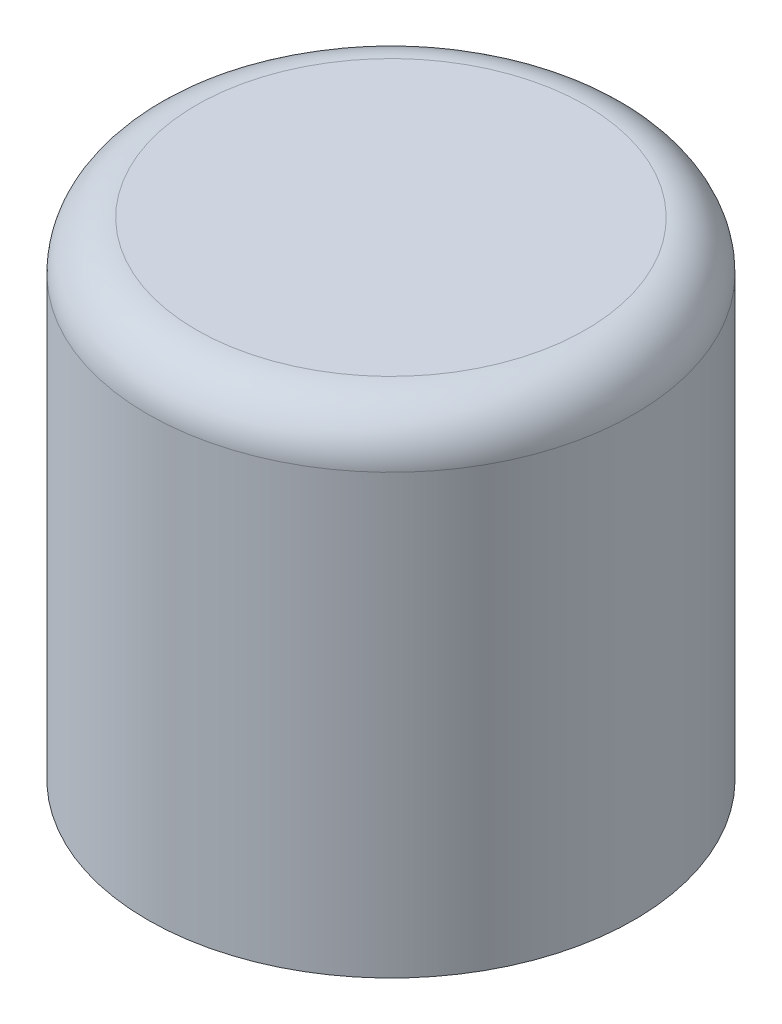
ISO-10303-21;
HEADER;
FILE_DESCRIPTION(('STEP AP214'),'2;1');
FILE_NAME('part.step','',(''),(''),'','','');
FILE_SCHEMA(('AUTOMOTIVE_DESIGN { 1 0 10303 214 1 1 1 1 }'));
ENDSEC;
DATA;
#1=APPLICATION_CONTEXT('core data for automotive mechanical design processes');
#2=APPLICATION_PROTOCOL_DEFINITION('international standard','automotive_design',2000,#1);
#3=PRODUCT_CONTEXT('',#1,'mechanical');
#4=PRODUCT('Part','Part','',(#3));
#5=PRODUCT_RELATED_PRODUCT_CATEGORY('part','',(#4));
#6=PRODUCT_DEFINITION_FORMATION('','',#4);
#7=PRODUCT_DEFINITION_CONTEXT('part definition',#1,'design');
#8=PRODUCT_DEFINITION('design','',#6,#7);
#9=PRODUCT_DEFINITION_SHAPE('','',#8);
#10=(LENGTH_UNIT() NAMED_UNIT(*) SI_UNIT(.MILLI.,.METRE.));
#11=(NAMED_UNIT(*) PLANE_ANGLE_UNIT() SI_UNIT($,.RADIAN.));
#12=(NAMED_UNIT(*) SI_UNIT($,.STERADIAN.) SOLID_ANGLE_UNIT());
#13=UNCERTAINTY_MEASURE_WITH_UNIT(LENGTH_MEASURE(1.E-05),#10,'distance_accuracy_value','');
#14=(GEOMETRIC_REPRESENTATION_CONTEXT(3) GLOBAL_UNCERTAINTY_ASSIGNED_CONTEXT((#13)) GLOBAL_UNIT_ASSIGNED_CONTEXT((#10,
#11,#12)) REPRESENTATION_CONTEXT('',''));
#15=CARTESIAN_POINT('',(0.,0.,0.));
#16=DIRECTION('',(0.,0.,1.));
#17=DIRECTION('',(1.,0.,0.));
#18=AXIS2_PLACEMENT_3D('',#15,#16,#17);
#19=CARTESIAN_POINT('',(0.,10.,0.));
#20=DIRECTION('',(0.,-1.,0.));
#21=DIRECTION('',(0.,0.,-1.));
#22=AXIS2_PLACEMENT_3D('',#19,#20,#21);
#23=CYLINDRICAL_SURFACE('',#22,5.);
#24=CARTESIAN_POINT('',(0.,9.,0.));
#25=DIRECTION('',(0.,1.,0.));
#26=DIRECTION('',(0.,0.,1.));
#27=AXIS2_PLACEMENT_3D('',#24,#25,#26);
#28=CIRCLE('',#27,5.);
#29=CARTESIAN_POINT('',(0.,9.,5.));
#30=VERTEX_POINT('',#29);
#31=EDGE_CURVE('E10',#30,#30,#28,.F.);
#32=ORIENTED_EDGE('',*,*,#31,.T.);
#33=EDGE_LOOP('',(#32));
#34=FACE_BOUND('',#33,.T.);
#35=CARTESIAN_POINT('',(0.,0.,0.));
#36=DIRECTION('',(0.,1.,0.));
#37=DIRECTION('',(0.,0.,1.));
#38=AXIS2_PLACEMENT_3D('',#35,#36,#37);
#39=CIRCLE('',#38,5.);
#40=CARTESIAN_POINT('',(0.,0.,5.));
#41=VERTEX_POINT('',#40);
#42=EDGE_CURVE('E44',#41,#41,#39,.T.);
#43=ORIENTED_EDGE('',*,*,#42,.T.);
#44=EDGE_LOOP('',(#43));
#45=FACE_BOUND('',#44,.T.);
#46=ADVANCED_FACE('F33',(#34,#45),#23,.T.);
#47=CARTESIAN_POINT('',(0.,10.,0.));
#48=DIRECTION('',(0.,1.,0.));
#49=DIRECTION('',(0.,0.,1.));
#50=AXIS2_PLACEMENT_3D('',#47,#48,#49);
#51=PLANE('',#50);
#52=CARTESIAN_POINT('',(0.,10.,0.));
#53=DIRECTION('',(0.,1.,0.));
#54=DIRECTION('',(0.,0.,1.));
#55=AXIS2_PLACEMENT_3D('',#52,#53,#54);
#56=CIRCLE('',#55,4.);
#57=CARTESIAN_POINT('',(0.,10.,4.));
#58=VERTEX_POINT('',#57);
#59=EDGE_CURVE('E40',#58,#58,#56,.T.);
#60=ORIENTED_EDGE('',*,*,#59,.T.);
#61=EDGE_LOOP('',(#60));
#62=FACE_BOUND('',#61,.T.);
#63=ADVANCED_FACE('F54',(#62),#51,.T.);
#64=CARTESIAN_POINT('',(0.,0.,0.));
#65=DIRECTION('',(0.,1.,0.));
#66=DIRECTION('',(0.,0.,1.));
#67=AXIS2_PLACEMENT_3D('',#64,#65,#66);
#68=PLANE('',#67);
#69=ORIENTED_EDGE('',*,*,#42,.F.);
#70=EDGE_LOOP('',(#69));
#71=FACE_BOUND('',#70,.T.);
#72=ADVANCED_FACE('F52',(#71),#68,.F.);
#73=CARTESIAN_POINT('',(0.,9.,0.));
#74=DIRECTION('',(0.,1.,0.));
#75=DIRECTION('',(0.,0.,1.));
#76=AXIS2_PLACEMENT_3D('',#73,#74,#75);
#77=TOROIDAL_SURFACE('',#76,4.,1.);
#78=ORIENTED_EDGE('',*,*,#31,.F.);
#79=EDGE_LOOP('',(#78));
#80=FACE_BOUND('',#79,.T.);
#81=ORIENTED_EDGE('',*,*,#59,.F.);
#82=EDGE_LOOP('',(#81));
#83=FACE_BOUND('',#82,.T.);
#84=ADVANCED_FACE('F35',(#80,#83),#77,.T.);
#85=CLOSED_SHELL('',(#46,#63,#72,#84));
#86=MANIFOLD_SOLID_BREP('B2',#85);
#87=ADVANCED_BREP_SHAPE_REPRESENTATION('',(#18,#86),#14);
#88=SHAPE_DEFINITION_REPRESENTATION(#9,#87);
ENDSEC;
END-ISO-10303-21;
